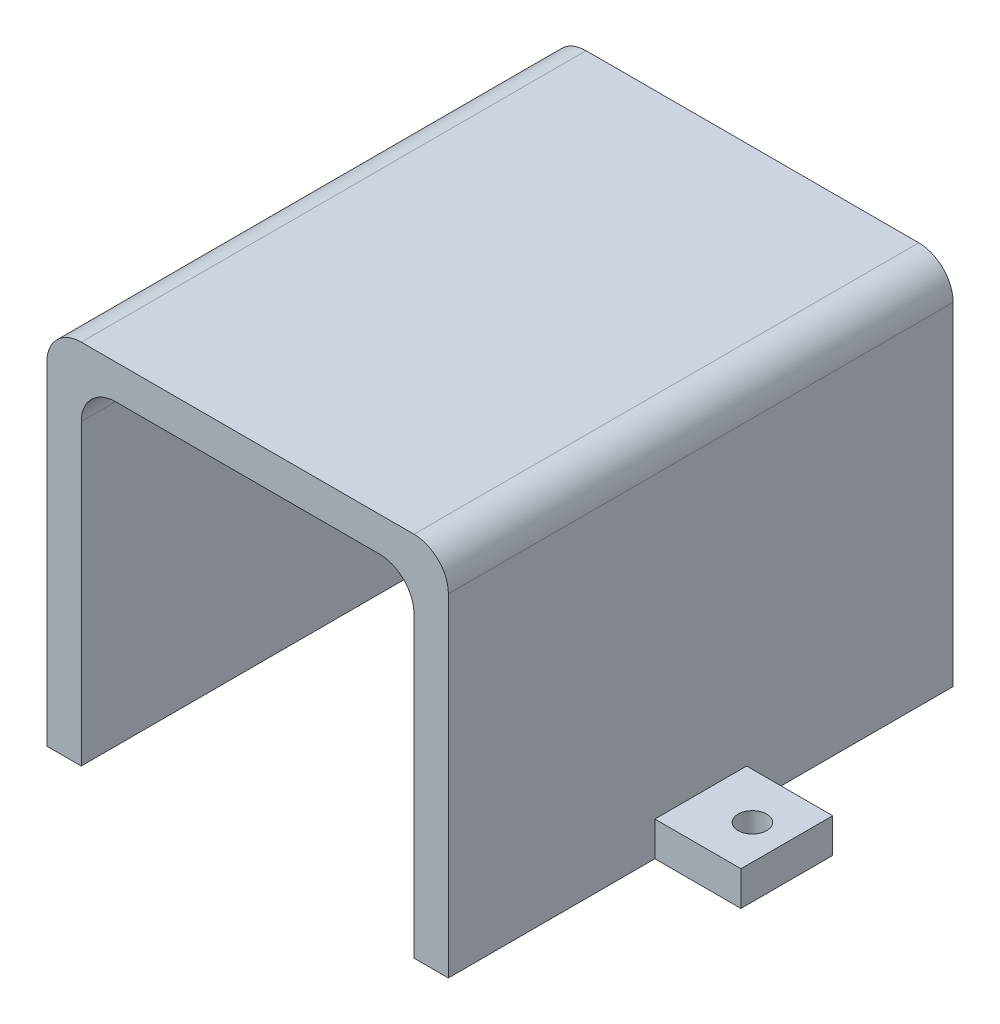
ISO-10303-21;
HEADER;
FILE_DESCRIPTION(('STEP AP214'),'2;1');
FILE_NAME('part.step','',(''),(''),'','','');
FILE_SCHEMA(('AUTOMOTIVE_DESIGN { 1 0 10303 214 1 1 1 1 }'));
ENDSEC;
DATA;
#1=APPLICATION_CONTEXT('core data for automotive mechanical design processes');
#2=APPLICATION_PROTOCOL_DEFINITION('international standard','automotive_design',2000,#1);
#3=PRODUCT_CONTEXT('',#1,'mechanical');
#4=PRODUCT('Part','Part','',(#3));
#5=PRODUCT_RELATED_PRODUCT_CATEGORY('part','',(#4));
#6=PRODUCT_DEFINITION_FORMATION('','',#4);
#7=PRODUCT_DEFINITION_CONTEXT('part definition',#1,'design');
#8=PRODUCT_DEFINITION('design','',#6,#7);
#9=PRODUCT_DEFINITION_SHAPE('','',#8);
#10=(LENGTH_UNIT() NAMED_UNIT(*) SI_UNIT(.MILLI.,.METRE.));
#11=(NAMED_UNIT(*) PLANE_ANGLE_UNIT() SI_UNIT($,.RADIAN.));
#12=(NAMED_UNIT(*) SI_UNIT($,.STERADIAN.) SOLID_ANGLE_UNIT());
#13=UNCERTAINTY_MEASURE_WITH_UNIT(LENGTH_MEASURE(1.E-05),#10,'distance_accuracy_value','');
#14=(GEOMETRIC_REPRESENTATION_CONTEXT(3) GLOBAL_UNCERTAINTY_ASSIGNED_CONTEXT((#13)) GLOBAL_UNIT_ASSIGNED_CONTEXT((#10,
#11,#12)) REPRESENTATION_CONTEXT('',''));
#15=CARTESIAN_POINT('',(0.,0.,0.));
#16=DIRECTION('',(0.,0.,1.));
#17=DIRECTION('',(1.,0.,0.));
#18=AXIS2_PLACEMENT_3D('',#15,#16,#17);
#19=CARTESIAN_POINT('',(-17.5,-12.,-4.));
#20=DIRECTION('',(0.,0.,-1.));
#21=DIRECTION('',(-1.,0.,0.));
#22=AXIS2_PLACEMENT_3D('',#19,#20,#21);
#23=PLANE('',#22);
#24=DIRECTION('',(1.,0.,0.));
#25=VECTOR('',#24,1.);
#26=CARTESIAN_POINT('',(-17.5,-15.,-4.));
#27=LINE('',#26,#25);
#28=CARTESIAN_POINT('',(-25.,-15.,-3.99999999999999));
#29=VERTEX_POINT('',#28);
#30=CARTESIAN_POINT('',(-17.5,-15.,-4.));
#31=VERTEX_POINT('',#30);
#32=EDGE_CURVE('E108',#29,#31,#27,.T.);
#33=ORIENTED_EDGE('',*,*,#32,.F.);
#34=DIRECTION('',(0.,-1.,0.));
#35=VECTOR('',#34,1.);
#36=CARTESIAN_POINT('',(-25.,-12.,-3.99999999999999));
#37=LINE('',#36,#35);
#38=CARTESIAN_POINT('',(-25.,-12.,-3.99999999999999));
#39=VERTEX_POINT('',#38);
#40=EDGE_CURVE('E12',#39,#29,#37,.T.);
#41=ORIENTED_EDGE('',*,*,#40,.F.);
#42=DIRECTION('',(1.,0.,0.));
#43=VECTOR('',#42,1.);
#44=CARTESIAN_POINT('',(-17.5,-12.,-4.));
#45=LINE('',#44,#43);
#46=CARTESIAN_POINT('',(-17.5,-12.,-4.));
#47=VERTEX_POINT('',#46);
#48=EDGE_CURVE('E101',#39,#47,#45,.T.);
#49=ORIENTED_EDGE('',*,*,#48,.T.);
#50=DIRECTION('',(0.,-1.,0.));
#51=VECTOR('',#50,1.);
#52=CARTESIAN_POINT('',(-17.5,-12.,-4.));
#53=LINE('',#52,#51);
#54=EDGE_CURVE('E46',#47,#31,#53,.T.);
#55=ORIENTED_EDGE('',*,*,#54,.T.);
#56=EDGE_LOOP('',(#33,#41,#49,#55));
#57=FACE_BOUND('',#56,.T.);
#58=ADVANCED_FACE('F43',(#57),#23,.T.);
#59=CARTESIAN_POINT('',(-25.,-12.,-3.99999999999999));
#60=DIRECTION('',(-1.,0.,0.));
#61=DIRECTION('',(0.,0.,1.));
#62=AXIS2_PLACEMENT_3D('',#59,#60,#61);
#63=PLANE('',#62);
#64=DIRECTION('',(0.,0.,-1.));
#65=VECTOR('',#64,1.);
#66=CARTESIAN_POINT('',(-25.,-15.,-3.99999999999999));
#67=LINE('',#66,#65);
#68=CARTESIAN_POINT('',(-25.,-15.,3.99999999999999));
#69=VERTEX_POINT('',#68);
#70=EDGE_CURVE('E103',#69,#29,#67,.T.);
#71=ORIENTED_EDGE('',*,*,#70,.F.);
#72=DIRECTION('',(0.,-1.,0.));
#73=VECTOR('',#72,1.);
#74=CARTESIAN_POINT('',(-25.,-12.,3.99999999999999));
#75=LINE('',#74,#73);
#76=CARTESIAN_POINT('',(-25.,-12.,3.99999999999999));
#77=VERTEX_POINT('',#76);
#78=EDGE_CURVE('E52',#77,#69,#75,.T.);
#79=ORIENTED_EDGE('',*,*,#78,.F.);
#80=DIRECTION('',(0.,0.,-1.));
#81=VECTOR('',#80,1.);
#82=CARTESIAN_POINT('',(-25.,-12.,-3.99999999999999));
#83=LINE('',#82,#81);
#84=EDGE_CURVE('E98',#77,#39,#83,.T.);
#85=ORIENTED_EDGE('',*,*,#84,.T.);
#86=ORIENTED_EDGE('',*,*,#40,.T.);
#87=EDGE_LOOP('',(#71,#79,#85,#86));
#88=FACE_BOUND('',#87,.T.);
#89=ADVANCED_FACE('F119',(#88),#63,.T.);
#90=CARTESIAN_POINT('',(-17.5,-12.,4.));
#91=DIRECTION('',(0.,0.,1.));
#92=DIRECTION('',(1.,0.,0.));
#93=AXIS2_PLACEMENT_3D('',#90,#91,#92);
#94=PLANE('',#93);
#95=DIRECTION('',(-1.,0.,0.));
#96=VECTOR('',#95,1.);
#97=CARTESIAN_POINT('',(-17.5,-15.,4.));
#98=LINE('',#97,#96);
#99=CARTESIAN_POINT('',(-17.5,-15.,4.));
#100=VERTEX_POINT('',#99);
#101=EDGE_CURVE('E93',#100,#69,#98,.T.);
#102=ORIENTED_EDGE('',*,*,#101,.F.);
#103=DIRECTION('',(0.,-1.,0.));
#104=VECTOR('',#103,1.);
#105=CARTESIAN_POINT('',(-17.5,-12.,4.));
#106=LINE('',#105,#104);
#107=CARTESIAN_POINT('',(-17.5,-12.,4.));
#108=VERTEX_POINT('',#107);
#109=EDGE_CURVE('E88',#108,#100,#106,.T.);
#110=ORIENTED_EDGE('',*,*,#109,.F.);
#111=DIRECTION('',(-1.,0.,0.));
#112=VECTOR('',#111,1.);
#113=CARTESIAN_POINT('',(-17.5,-12.,4.));
#114=LINE('',#113,#112);
#115=EDGE_CURVE('E91',#108,#77,#114,.T.);
#116=ORIENTED_EDGE('',*,*,#115,.T.);
#117=ORIENTED_EDGE('',*,*,#78,.T.);
#118=EDGE_LOOP('',(#102,#110,#116,#117));
#119=FACE_BOUND('',#118,.T.);
#120=ADVANCED_FACE('F90',(#119),#94,.T.);
#121=CARTESIAN_POINT('',(-17.5,-12.,-4.));
#122=DIRECTION('',(1.,0.,0.));
#123=DIRECTION('',(0.,0.,-1.));
#124=AXIS2_PLACEMENT_3D('',#121,#122,#123);
#125=PLANE('',#124);
#126=DIRECTION('',(0.,0.,1.));
#127=VECTOR('',#126,1.);
#128=CARTESIAN_POINT('',(-17.5,-15.,-4.));
#129=LINE('',#128,#127);
#130=EDGE_CURVE('E111',#31,#100,#129,.T.);
#131=ORIENTED_EDGE('',*,*,#130,.F.);
#132=ORIENTED_EDGE('',*,*,#54,.F.);
#133=DIRECTION('',(0.,0.,1.));
#134=VECTOR('',#133,1.);
#135=CARTESIAN_POINT('',(-17.5,-12.,-4.));
#136=LINE('',#135,#134);
#137=EDGE_CURVE('E97',#47,#108,#136,.T.);
#138=ORIENTED_EDGE('',*,*,#137,.T.);
#139=ORIENTED_EDGE('',*,*,#109,.T.);
#140=EDGE_LOOP('',(#131,#132,#138,#139));
#141=FACE_BOUND('',#140,.T.);
#142=ADVANCED_FACE('F100',(#141),#125,.T.);
#143=CARTESIAN_POINT('',(0.,-12.,0.));
#144=DIRECTION('',(0.,1.,0.));
#145=DIRECTION('',(0.,0.,1.));
#146=AXIS2_PLACEMENT_3D('',#143,#144,#145);
#147=PLANE('',#146);
#148=CARTESIAN_POINT('',(-22.,-12.,0.));
#149=DIRECTION('',(0.,-1.,0.));
#150=DIRECTION('',(0.,0.,-1.));
#151=AXIS2_PLACEMENT_3D('',#148,#149,#150);
#152=CIRCLE('',#151,1.25);
#153=CARTESIAN_POINT('',(-22.,-12.,-1.25000000000001));
#154=VERTEX_POINT('',#153);
#155=EDGE_CURVE('E112',#154,#154,#152,.T.);
#156=ORIENTED_EDGE('',*,*,#155,.T.);
#157=EDGE_LOOP('',(#156));
#158=FACE_BOUND('',#157,.T.);
#159=ORIENTED_EDGE('',*,*,#48,.F.);
#160=ORIENTED_EDGE('',*,*,#84,.F.);
#161=ORIENTED_EDGE('',*,*,#115,.F.);
#162=ORIENTED_EDGE('',*,*,#137,.F.);
#163=EDGE_LOOP('',(#159,#160,#161,#162));
#164=FACE_BOUND('',#163,.T.);
#165=ADVANCED_FACE('F96',(#158,#164),#147,.T.);
#166=CARTESIAN_POINT('',(0.,-15.,0.));
#167=DIRECTION('',(0.,1.,0.));
#168=DIRECTION('',(0.,0.,1.));
#169=AXIS2_PLACEMENT_3D('',#166,#167,#168);
#170=PLANE('',#169);
#171=CARTESIAN_POINT('',(-22.,-15.,0.));
#172=DIRECTION('',(0.,-1.,0.));
#173=DIRECTION('',(0.,0.,-1.));
#174=AXIS2_PLACEMENT_3D('',#171,#172,#173);
#175=CIRCLE('',#174,1.24999999999999);
#176=CARTESIAN_POINT('',(-22.,-15.,-1.25));
#177=VERTEX_POINT('',#176);
#178=EDGE_CURVE('E149',#177,#177,#175,.T.);
#179=ORIENTED_EDGE('',*,*,#178,.F.);
#180=EDGE_LOOP('',(#179));
#181=FACE_BOUND('',#180,.T.);
#182=ORIENTED_EDGE('',*,*,#32,.T.);
#183=ORIENTED_EDGE('',*,*,#130,.T.);
#184=ORIENTED_EDGE('',*,*,#101,.T.);
#185=ORIENTED_EDGE('',*,*,#70,.T.);
#186=EDGE_LOOP('',(#182,#183,#184,#185));
#187=FACE_BOUND('',#186,.T.);
#188=ADVANCED_FACE('F118',(#181,#187),#170,.F.);
#189=CARTESIAN_POINT('',(-22.,-15.,0.));
#190=DIRECTION('',(0.,-1.,0.));
#191=DIRECTION('',(0.,0.,-1.));
#192=AXIS2_PLACEMENT_3D('',#189,#190,#191);
#193=CYLINDRICAL_SURFACE('',#192,1.24999999999999);
#194=ORIENTED_EDGE('',*,*,#155,.F.);
#195=EDGE_LOOP('',(#194));
#196=FACE_BOUND('',#195,.T.);
#197=ORIENTED_EDGE('',*,*,#178,.T.);
#198=EDGE_LOOP('',(#197));
#199=FACE_BOUND('',#198,.T.);
#200=ADVANCED_FACE('F137',(#196,#199),#193,.F.);
#201=CLOSED_SHELL('',(#58,#89,#120,#142,#165,#188,#200));
#202=MANIFOLD_SOLID_BREP('B2',#201);
#203=CARTESIAN_POINT('',(17.5,-12.,-4.));
#204=DIRECTION('',(-1.,0.,0.));
#205=DIRECTION('',(0.,0.,1.));
#206=AXIS2_PLACEMENT_3D('',#203,#204,#205);
#207=PLANE('',#206);
#208=DIRECTION('',(0.,0.,-1.));
#209=VECTOR('',#208,1.);
#210=CARTESIAN_POINT('',(17.5,-15.,-4.));
#211=LINE('',#210,#209);
#212=CARTESIAN_POINT('',(17.5,-15.,4.));
#213=VERTEX_POINT('',#212);
#214=CARTESIAN_POINT('',(17.5,-15.,-4.));
#215=VERTEX_POINT('',#214);
#216=EDGE_CURVE('E261',#213,#215,#211,.T.);
#217=ORIENTED_EDGE('',*,*,#216,.F.);
#218=DIRECTION('',(0.,-1.,0.));
#219=VECTOR('',#218,1.);
#220=CARTESIAN_POINT('',(17.5,-12.,4.));
#221=LINE('',#220,#219);
#222=CARTESIAN_POINT('',(17.5,-12.,4.));
#223=VERTEX_POINT('',#222);
#224=EDGE_CURVE('E41',#223,#213,#221,.T.);
#225=ORIENTED_EDGE('',*,*,#224,.F.);
#226=DIRECTION('',(0.,0.,-1.));
#227=VECTOR('',#226,1.);
#228=CARTESIAN_POINT('',(17.5,-12.,-4.));
#229=LINE('',#228,#227);
#230=CARTESIAN_POINT('',(17.5,-12.,-4.));
#231=VERTEX_POINT('',#230);
#232=EDGE_CURVE('E254',#223,#231,#229,.T.);
#233=ORIENTED_EDGE('',*,*,#232,.T.);
#234=DIRECTION('',(0.,-1.,0.));
#235=VECTOR('',#234,1.);
#236=CARTESIAN_POINT('',(17.5,-12.,-4.));
#237=LINE('',#236,#235);
#238=EDGE_CURVE('E199',#231,#215,#237,.T.);
#239=ORIENTED_EDGE('',*,*,#238,.T.);
#240=EDGE_LOOP('',(#217,#225,#233,#239));
#241=FACE_BOUND('',#240,.T.);
#242=ADVANCED_FACE('F196',(#241),#207,.T.);
#243=CARTESIAN_POINT('',(17.5,-12.,4.));
#244=DIRECTION('',(0.,0.,1.));
#245=DIRECTION('',(1.,0.,0.));
#246=AXIS2_PLACEMENT_3D('',#243,#244,#245);
#247=PLANE('',#246);
#248=DIRECTION('',(-1.,0.,0.));
#249=VECTOR('',#248,1.);
#250=CARTESIAN_POINT('',(17.5,-15.,4.));
#251=LINE('',#250,#249);
#252=CARTESIAN_POINT('',(25.,-15.,4.));
#253=VERTEX_POINT('',#252);
#254=EDGE_CURVE('E256',#253,#213,#251,.T.);
#255=ORIENTED_EDGE('',*,*,#254,.F.);
#256=DIRECTION('',(0.,-1.,0.));
#257=VECTOR('',#256,1.);
#258=CARTESIAN_POINT('',(25.,-12.,4.));
#259=LINE('',#258,#257);
#260=CARTESIAN_POINT('',(25.,-12.,4.));
#261=VERTEX_POINT('',#260);
#262=EDGE_CURVE('E205',#261,#253,#259,.T.);
#263=ORIENTED_EDGE('',*,*,#262,.F.);
#264=DIRECTION('',(-1.,0.,0.));
#265=VECTOR('',#264,1.);
#266=CARTESIAN_POINT('',(17.5,-12.,4.));
#267=LINE('',#266,#265);
#268=EDGE_CURVE('E251',#261,#223,#267,.T.);
#269=ORIENTED_EDGE('',*,*,#268,.T.);
#270=ORIENTED_EDGE('',*,*,#224,.T.);
#271=EDGE_LOOP('',(#255,#263,#269,#270));
#272=FACE_BOUND('',#271,.T.);
#273=ADVANCED_FACE('F272',(#272),#247,.T.);
#274=CARTESIAN_POINT('',(25.,-12.,-4.));
#275=DIRECTION('',(1.,0.,0.));
#276=DIRECTION('',(0.,0.,-1.));
#277=AXIS2_PLACEMENT_3D('',#274,#275,#276);
#278=PLANE('',#277);
#279=DIRECTION('',(0.,0.,1.));
#280=VECTOR('',#279,1.);
#281=CARTESIAN_POINT('',(25.,-15.,-4.));
#282=LINE('',#281,#280);
#283=CARTESIAN_POINT('',(25.,-15.,-4.));
#284=VERTEX_POINT('',#283);
#285=EDGE_CURVE('E246',#284,#253,#282,.T.);
#286=ORIENTED_EDGE('',*,*,#285,.F.);
#287=DIRECTION('',(0.,-1.,0.));
#288=VECTOR('',#287,1.);
#289=CARTESIAN_POINT('',(25.,-12.,-4.));
#290=LINE('',#289,#288);
#291=CARTESIAN_POINT('',(25.,-12.,-4.));
#292=VERTEX_POINT('',#291);
#293=EDGE_CURVE('E241',#292,#284,#290,.T.);
#294=ORIENTED_EDGE('',*,*,#293,.F.);
#295=DIRECTION('',(0.,0.,1.));
#296=VECTOR('',#295,1.);
#297=CARTESIAN_POINT('',(25.,-12.,-4.));
#298=LINE('',#297,#296);
#299=EDGE_CURVE('E244',#292,#261,#298,.T.);
#300=ORIENTED_EDGE('',*,*,#299,.T.);
#301=ORIENTED_EDGE('',*,*,#262,.T.);
#302=EDGE_LOOP('',(#286,#294,#300,#301));
#303=FACE_BOUND('',#302,.T.);
#304=ADVANCED_FACE('F243',(#303),#278,.T.);
#305=CARTESIAN_POINT('',(17.5,-12.,-4.));
#306=DIRECTION('',(0.,0.,-1.));
#307=DIRECTION('',(-1.,0.,0.));
#308=AXIS2_PLACEMENT_3D('',#305,#306,#307);
#309=PLANE('',#308);
#310=DIRECTION('',(1.,0.,0.));
#311=VECTOR('',#310,1.);
#312=CARTESIAN_POINT('',(17.5,-15.,-4.));
#313=LINE('',#312,#311);
#314=EDGE_CURVE('E264',#215,#284,#313,.T.);
#315=ORIENTED_EDGE('',*,*,#314,.F.);
#316=ORIENTED_EDGE('',*,*,#238,.F.);
#317=DIRECTION('',(1.,0.,0.));
#318=VECTOR('',#317,1.);
#319=CARTESIAN_POINT('',(17.5,-12.,-4.));
#320=LINE('',#319,#318);
#321=EDGE_CURVE('E250',#231,#292,#320,.T.);
#322=ORIENTED_EDGE('',*,*,#321,.T.);
#323=ORIENTED_EDGE('',*,*,#293,.T.);
#324=EDGE_LOOP('',(#315,#316,#322,#323));
#325=FACE_BOUND('',#324,.T.);
#326=ADVANCED_FACE('F253',(#325),#309,.T.);
#327=CARTESIAN_POINT('',(0.,-12.,0.));
#328=DIRECTION('',(0.,1.,0.));
#329=DIRECTION('',(0.,0.,1.));
#330=AXIS2_PLACEMENT_3D('',#327,#328,#329);
#331=PLANE('',#330);
#332=CARTESIAN_POINT('',(22.,-12.,0.));
#333=DIRECTION('',(0.,-1.,0.));
#334=DIRECTION('',(0.,0.,-1.));
#335=AXIS2_PLACEMENT_3D('',#332,#333,#334);
#336=CIRCLE('',#335,1.25);
#337=CARTESIAN_POINT('',(22.,-12.,-1.25));
#338=VERTEX_POINT('',#337);
#339=EDGE_CURVE('E265',#338,#338,#336,.T.);
#340=ORIENTED_EDGE('',*,*,#339,.T.);
#341=EDGE_LOOP('',(#340));
#342=FACE_BOUND('',#341,.T.);
#343=ORIENTED_EDGE('',*,*,#232,.F.);
#344=ORIENTED_EDGE('',*,*,#268,.F.);
#345=ORIENTED_EDGE('',*,*,#299,.F.);
#346=ORIENTED_EDGE('',*,*,#321,.F.);
#347=EDGE_LOOP('',(#343,#344,#345,#346));
#348=FACE_BOUND('',#347,.T.);
#349=ADVANCED_FACE('F249',(#342,#348),#331,.T.);
#350=CARTESIAN_POINT('',(0.,-15.,0.));
#351=DIRECTION('',(0.,1.,0.));
#352=DIRECTION('',(0.,0.,1.));
#353=AXIS2_PLACEMENT_3D('',#350,#351,#352);
#354=PLANE('',#353);
#355=CARTESIAN_POINT('',(22.,-15.,0.));
#356=DIRECTION('',(0.,-1.,0.));
#357=DIRECTION('',(0.,0.,-1.));
#358=AXIS2_PLACEMENT_3D('',#355,#356,#357);
#359=CIRCLE('',#358,1.24999999999999);
#360=CARTESIAN_POINT('',(22.,-15.,-1.24999999999999));
#361=VERTEX_POINT('',#360);
#362=EDGE_CURVE('E302',#361,#361,#359,.T.);
#363=ORIENTED_EDGE('',*,*,#362,.F.);
#364=EDGE_LOOP('',(#363));
#365=FACE_BOUND('',#364,.T.);
#366=ORIENTED_EDGE('',*,*,#216,.T.);
#367=ORIENTED_EDGE('',*,*,#314,.T.);
#368=ORIENTED_EDGE('',*,*,#285,.T.);
#369=ORIENTED_EDGE('',*,*,#254,.T.);
#370=EDGE_LOOP('',(#366,#367,#368,#369));
#371=FACE_BOUND('',#370,.T.);
#372=ADVANCED_FACE('F271',(#365,#371),#354,.F.);
#373=CARTESIAN_POINT('',(22.,-15.,0.));
#374=DIRECTION('',(0.,-1.,0.));
#375=DIRECTION('',(0.,0.,-1.));
#376=AXIS2_PLACEMENT_3D('',#373,#374,#375);
#377=CYLINDRICAL_SURFACE('',#376,1.24999999999999);
#378=ORIENTED_EDGE('',*,*,#339,.F.);
#379=EDGE_LOOP('',(#378));
#380=FACE_BOUND('',#379,.T.);
#381=ORIENTED_EDGE('',*,*,#362,.T.);
#382=EDGE_LOOP('',(#381));
#383=FACE_BOUND('',#382,.T.);
#384=ADVANCED_FACE('F290',(#380,#383),#377,.F.);
#385=CLOSED_SHELL('',(#242,#273,#304,#326,#349,#372,#384));
#386=MANIFOLD_SOLID_BREP('B6',#385);
#387=CARTESIAN_POINT('',(14.5,-15.,22.));
#388=DIRECTION('',(1.,0.,0.));
#389=DIRECTION('',(0.,0.,-1.));
#390=AXIS2_PLACEMENT_3D('',#387,#388,#389);
#391=PLANE('',#390);
#392=DIRECTION('',(0.,-1.,0.));
#393=VECTOR('',#392,1.);
#394=CARTESIAN_POINT('',(14.5,-15.,22.));
#395=LINE('',#394,#393);
#396=CARTESIAN_POINT('',(14.5,11.,22.));
#397=VERTEX_POINT('',#396);
#398=CARTESIAN_POINT('',(14.5,-15.,22.));
#399=VERTEX_POINT('',#398);
#400=EDGE_CURVE('E431',#397,#399,#395,.T.);
#401=ORIENTED_EDGE('',*,*,#400,.F.);
#402=DIRECTION('',(0.,0.,-1.));
#403=VECTOR('',#402,1.);
#404=CARTESIAN_POINT('',(14.5,11.,-22.));
#405=LINE('',#404,#403);
#406=CARTESIAN_POINT('',(14.5,11.,-22.));
#407=VERTEX_POINT('',#406);
#408=EDGE_CURVE('E456',#397,#407,#405,.T.);
#409=ORIENTED_EDGE('',*,*,#408,.T.);
#410=DIRECTION('',(0.,-1.,0.));
#411=VECTOR('',#410,1.);
#412=CARTESIAN_POINT('',(14.5,-15.,-22.));
#413=LINE('',#412,#411);
#414=CARTESIAN_POINT('',(14.5,-15.,-22.));
#415=VERTEX_POINT('',#414);
#416=EDGE_CURVE('E454',#407,#415,#413,.T.);
#417=ORIENTED_EDGE('',*,*,#416,.T.);
#418=DIRECTION('',(0.,0.,-1.));
#419=VECTOR('',#418,1.);
#420=CARTESIAN_POINT('',(14.5,-15.,22.));
#421=LINE('',#420,#419);
#422=EDGE_CURVE('E448',#399,#415,#421,.T.);
#423=ORIENTED_EDGE('',*,*,#422,.F.);
#424=EDGE_LOOP('',(#401,#409,#417,#423));
#425=FACE_BOUND('',#424,.T.);
#426=ADVANCED_FACE('F340',(#425),#391,.F.);
#427=CARTESIAN_POINT('',(14.5,-15.,22.));
#428=DIRECTION('',(0.,1.,0.));
#429=DIRECTION('',(0.,0.,1.));
#430=AXIS2_PLACEMENT_3D('',#427,#428,#429);
#431=PLANE('',#430);
#432=DIRECTION('',(1.,0.,0.));
#433=VECTOR('',#432,1.);
#434=CARTESIAN_POINT('',(14.5,-15.,-22.));
#435=LINE('',#434,#433);
#436=CARTESIAN_POINT('',(17.5,-15.,-22.));
#437=VERTEX_POINT('',#436);
#438=EDGE_CURVE('E524',#415,#437,#435,.T.);
#439=ORIENTED_EDGE('',*,*,#438,.T.);
#440=DIRECTION('',(0.,0.,-1.));
#441=VECTOR('',#440,1.);
#442=CARTESIAN_POINT('',(17.5,-15.,22.));
#443=LINE('',#442,#441);
#444=CARTESIAN_POINT('',(17.5,-15.,22.));
#445=VERTEX_POINT('',#444);
#446=EDGE_CURVE('E450',#445,#437,#443,.T.);
#447=ORIENTED_EDGE('',*,*,#446,.F.);
#448=DIRECTION('',(1.,0.,0.));
#449=VECTOR('',#448,1.);
#450=CARTESIAN_POINT('',(14.5,-15.,22.));
#451=LINE('',#450,#449);
#452=EDGE_CURVE('E434',#399,#445,#451,.T.);
#453=ORIENTED_EDGE('',*,*,#452,.F.);
#454=ORIENTED_EDGE('',*,*,#422,.T.);
#455=EDGE_LOOP('',(#439,#447,#453,#454));
#456=FACE_BOUND('',#455,.T.);
#457=ADVANCED_FACE('F447',(#456),#431,.F.);
#458=CARTESIAN_POINT('',(17.5,-15.,22.));
#459=DIRECTION('',(-1.,0.,0.));
#460=DIRECTION('',(0.,0.,1.));
#461=AXIS2_PLACEMENT_3D('',#458,#459,#460);
#462=PLANE('',#461);
#463=DIRECTION('',(0.,1.,0.));
#464=VECTOR('',#463,1.);
#465=CARTESIAN_POINT('',(17.5,-15.,-22.));
#466=LINE('',#465,#464);
#467=CARTESIAN_POINT('',(17.5,14.,-22.));
#468=VERTEX_POINT('',#467);
#469=EDGE_CURVE('E526',#437,#468,#466,.T.);
#470=ORIENTED_EDGE('',*,*,#469,.T.);
#471=DIRECTION('',(0.,0.,-1.));
#472=VECTOR('',#471,1.);
#473=CARTESIAN_POINT('',(17.5,14.,22.));
#474=LINE('',#473,#472);
#475=CARTESIAN_POINT('',(17.5,14.,22.));
#476=VERTEX_POINT('',#475);
#477=EDGE_CURVE('E355',#468,#476,#474,.F.);
#478=ORIENTED_EDGE('',*,*,#477,.T.);
#479=DIRECTION('',(0.,1.,0.));
#480=VECTOR('',#479,1.);
#481=CARTESIAN_POINT('',(17.5,-15.,22.));
#482=LINE('',#481,#480);
#483=EDGE_CURVE('E451',#445,#476,#482,.T.);
#484=ORIENTED_EDGE('',*,*,#483,.F.);
#485=ORIENTED_EDGE('',*,*,#446,.T.);
#486=EDGE_LOOP('',(#470,#478,#484,#485));
#487=FACE_BOUND('',#486,.T.);
#488=ADVANCED_FACE('F556',(#487),#462,.F.);
#489=CARTESIAN_POINT('',(-17.5,17.,22.));
#490=DIRECTION('',(0.,-1.,0.));
#491=DIRECTION('',(0.,0.,-1.));
#492=AXIS2_PLACEMENT_3D('',#489,#490,#491);
#493=PLANE('',#492);
#494=DIRECTION('',(-1.,0.,0.));
#495=VECTOR('',#494,1.);
#496=CARTESIAN_POINT('',(-17.5,17.,-22.));
#497=LINE('',#496,#495);
#498=CARTESIAN_POINT('',(14.5,17.,-22.));
#499=VERTEX_POINT('',#498);
#500=CARTESIAN_POINT('',(-14.5,17.,-22.));
#501=VERTEX_POINT('',#500);
#502=EDGE_CURVE('E528',#499,#501,#497,.T.);
#503=ORIENTED_EDGE('',*,*,#502,.T.);
#504=DIRECTION('',(0.,0.,-1.));
#505=VECTOR('',#504,1.);
#506=CARTESIAN_POINT('',(-14.5,17.,22.));
#507=LINE('',#506,#505);
#508=CARTESIAN_POINT('',(-14.5,17.,22.));
#509=VERTEX_POINT('',#508);
#510=EDGE_CURVE('E363',#501,#509,#507,.F.);
#511=ORIENTED_EDGE('',*,*,#510,.T.);
#512=DIRECTION('',(-1.,0.,0.));
#513=VECTOR('',#512,1.);
#514=CARTESIAN_POINT('',(-17.5,17.,22.));
#515=LINE('',#514,#513);
#516=CARTESIAN_POINT('',(14.5,17.,22.));
#517=VERTEX_POINT('',#516);
#518=EDGE_CURVE('E547',#517,#509,#515,.T.);
#519=ORIENTED_EDGE('',*,*,#518,.F.);
#520=DIRECTION('',(0.,0.,-1.));
#521=VECTOR('',#520,1.);
#522=CARTESIAN_POINT('',(14.5,17.,22.));
#523=LINE('',#522,#521);
#524=EDGE_CURVE('E477',#517,#499,#523,.T.);
#525=ORIENTED_EDGE('',*,*,#524,.T.);
#526=EDGE_LOOP('',(#503,#511,#519,#525));
#527=FACE_BOUND('',#526,.T.);
#528=ADVANCED_FACE('F554',(#527),#493,.F.);
#529=CARTESIAN_POINT('',(-17.5,-15.,22.));
#530=DIRECTION('',(1.,0.,0.));
#531=DIRECTION('',(0.,0.,-1.));
#532=AXIS2_PLACEMENT_3D('',#529,#530,#531);
#533=PLANE('',#532);
#534=DIRECTION('',(0.,-1.,0.));
#535=VECTOR('',#534,1.);
#536=CARTESIAN_POINT('',(-17.5,-15.,22.));
#537=LINE('',#536,#535);
#538=CARTESIAN_POINT('',(-17.5,14.,22.));
#539=VERTEX_POINT('',#538);
#540=CARTESIAN_POINT('',(-17.5,-15.,22.));
#541=VERTEX_POINT('',#540);
#542=EDGE_CURVE('E543',#539,#541,#537,.T.);
#543=ORIENTED_EDGE('',*,*,#542,.F.);
#544=DIRECTION('',(0.,0.,-1.));
#545=VECTOR('',#544,1.);
#546=CARTESIAN_POINT('',(-17.5,14.,22.));
#547=LINE('',#546,#545);
#548=CARTESIAN_POINT('',(-17.5,14.,-22.));
#549=VERTEX_POINT('',#548);
#550=EDGE_CURVE('E470',#539,#549,#547,.T.);
#551=ORIENTED_EDGE('',*,*,#550,.T.);
#552=DIRECTION('',(0.,-1.,0.));
#553=VECTOR('',#552,1.);
#554=CARTESIAN_POINT('',(-17.5,-15.,-22.));
#555=LINE('',#554,#553);
#556=CARTESIAN_POINT('',(-17.5,-15.,-22.));
#557=VERTEX_POINT('',#556);
#558=EDGE_CURVE('E530',#549,#557,#555,.T.);
#559=ORIENTED_EDGE('',*,*,#558,.T.);
#560=DIRECTION('',(0.,0.,-1.));
#561=VECTOR('',#560,1.);
#562=CARTESIAN_POINT('',(-17.5,-15.,22.));
#563=LINE('',#562,#561);
#564=EDGE_CURVE('E460',#541,#557,#563,.T.);
#565=ORIENTED_EDGE('',*,*,#564,.F.);
#566=EDGE_LOOP('',(#543,#551,#559,#565));
#567=FACE_BOUND('',#566,.T.);
#568=ADVANCED_FACE('F541',(#567),#533,.F.);
#569=CARTESIAN_POINT('',(-17.5,-15.,22.));
#570=DIRECTION('',(0.,1.,0.));
#571=DIRECTION('',(0.,0.,1.));
#572=AXIS2_PLACEMENT_3D('',#569,#570,#571);
#573=PLANE('',#572);
#574=DIRECTION('',(1.,0.,0.));
#575=VECTOR('',#574,1.);
#576=CARTESIAN_POINT('',(-17.5,-15.,-22.));
#577=LINE('',#576,#575);
#578=CARTESIAN_POINT('',(-14.5,-15.,-22.));
#579=VERTEX_POINT('',#578);
#580=EDGE_CURVE('E507',#557,#579,#577,.T.);
#581=ORIENTED_EDGE('',*,*,#580,.T.);
#582=DIRECTION('',(0.,0.,-1.));
#583=VECTOR('',#582,1.);
#584=CARTESIAN_POINT('',(-14.5,-15.,22.));
#585=LINE('',#584,#583);
#586=CARTESIAN_POINT('',(-14.5,-15.,22.));
#587=VERTEX_POINT('',#586);
#588=EDGE_CURVE('E506',#587,#579,#585,.T.);
#589=ORIENTED_EDGE('',*,*,#588,.F.);
#590=DIRECTION('',(1.,0.,0.));
#591=VECTOR('',#590,1.);
#592=CARTESIAN_POINT('',(-17.5,-15.,22.));
#593=LINE('',#592,#591);
#594=EDGE_CURVE('E519',#541,#587,#593,.T.);
#595=ORIENTED_EDGE('',*,*,#594,.F.);
#596=ORIENTED_EDGE('',*,*,#564,.T.);
#597=EDGE_LOOP('',(#581,#589,#595,#596));
#598=FACE_BOUND('',#597,.T.);
#599=ADVANCED_FACE('F537',(#598),#573,.F.);
#600=CARTESIAN_POINT('',(-14.5,-15.,22.));
#601=DIRECTION('',(-1.,0.,0.));
#602=DIRECTION('',(0.,0.,1.));
#603=AXIS2_PLACEMENT_3D('',#600,#601,#602);
#604=PLANE('',#603);
#605=DIRECTION('',(0.,1.,0.));
#606=VECTOR('',#605,1.);
#607=CARTESIAN_POINT('',(-14.5,-15.,-22.));
#608=LINE('',#607,#606);
#609=CARTESIAN_POINT('',(-14.5,11.,-22.));
#610=VERTEX_POINT('',#609);
#611=EDGE_CURVE('E495',#579,#610,#608,.T.);
#612=ORIENTED_EDGE('',*,*,#611,.T.);
#613=DIRECTION('',(0.,0.,-1.));
#614=VECTOR('',#613,1.);
#615=CARTESIAN_POINT('',(-14.5,11.,22.));
#616=LINE('',#615,#614);
#617=CARTESIAN_POINT('',(-14.5,11.,22.));
#618=VERTEX_POINT('',#617);
#619=EDGE_CURVE('E468',#610,#618,#616,.F.);
#620=ORIENTED_EDGE('',*,*,#619,.T.);
#621=DIRECTION('',(0.,1.,0.));
#622=VECTOR('',#621,1.);
#623=CARTESIAN_POINT('',(-14.5,-15.,22.));
#624=LINE('',#623,#622);
#625=EDGE_CURVE('E513',#587,#618,#624,.T.);
#626=ORIENTED_EDGE('',*,*,#625,.F.);
#627=ORIENTED_EDGE('',*,*,#588,.T.);
#628=EDGE_LOOP('',(#612,#620,#626,#627));
#629=FACE_BOUND('',#628,.T.);
#630=ADVANCED_FACE('F502',(#629),#604,.F.);
#631=CARTESIAN_POINT('',(-14.5,14.,22.));
#632=DIRECTION('',(0.,1.,0.));
#633=DIRECTION('',(0.,0.,1.));
#634=AXIS2_PLACEMENT_3D('',#631,#632,#633);
#635=PLANE('',#634);
#636=DIRECTION('',(1.,0.,0.));
#637=VECTOR('',#636,1.);
#638=CARTESIAN_POINT('',(-14.5,14.,-22.));
#639=LINE('',#638,#637);
#640=CARTESIAN_POINT('',(-11.5,14.,-22.));
#641=VERTEX_POINT('',#640);
#642=CARTESIAN_POINT('',(11.5,14.,-22.));
#643=VERTEX_POINT('',#642);
#644=EDGE_CURVE('E443',#641,#643,#639,.T.);
#645=ORIENTED_EDGE('',*,*,#644,.T.);
#646=DIRECTION('',(0.,0.,-1.));
#647=VECTOR('',#646,1.);
#648=CARTESIAN_POINT('',(11.5,14.,22.));
#649=LINE('',#648,#647);
#650=CARTESIAN_POINT('',(11.5,14.,22.));
#651=VERTEX_POINT('',#650);
#652=EDGE_CURVE('E466',#643,#651,#649,.F.);
#653=ORIENTED_EDGE('',*,*,#652,.T.);
#654=DIRECTION('',(1.,0.,0.));
#655=VECTOR('',#654,1.);
#656=CARTESIAN_POINT('',(-14.5,14.,22.));
#657=LINE('',#656,#655);
#658=CARTESIAN_POINT('',(-11.5,14.,22.));
#659=VERTEX_POINT('',#658);
#660=EDGE_CURVE('E512',#659,#651,#657,.T.);
#661=ORIENTED_EDGE('',*,*,#660,.F.);
#662=DIRECTION('',(0.,0.,-1.));
#663=VECTOR('',#662,1.);
#664=CARTESIAN_POINT('',(-11.5,14.,-22.));
#665=LINE('',#664,#663);
#666=EDGE_CURVE('E458',#659,#641,#665,.T.);
#667=ORIENTED_EDGE('',*,*,#666,.T.);
#668=EDGE_LOOP('',(#645,#653,#661,#667));
#669=FACE_BOUND('',#668,.T.);
#670=ADVANCED_FACE('F515',(#669),#635,.F.);
#671=CARTESIAN_POINT('',(0.,0.,22.));
#672=DIRECTION('',(0.,0.,-1.));
#673=DIRECTION('',(-1.,0.,0.));
#674=AXIS2_PLACEMENT_3D('',#671,#672,#673);
#675=PLANE('',#674);
#676=ORIENTED_EDGE('',*,*,#518,.T.);
#677=CARTESIAN_POINT('',(-14.5,14.,22.));
#678=DIRECTION('',(0.,0.,-1.));
#679=DIRECTION('',(-1.,0.,0.));
#680=AXIS2_PLACEMENT_3D('',#677,#678,#679);
#681=CIRCLE('',#680,3.);
#682=EDGE_CURVE('E483',#509,#539,#681,.F.);
#683=ORIENTED_EDGE('',*,*,#682,.T.);
#684=ORIENTED_EDGE('',*,*,#542,.T.);
#685=ORIENTED_EDGE('',*,*,#594,.T.);
#686=ORIENTED_EDGE('',*,*,#625,.T.);
#687=CARTESIAN_POINT('',(-11.5,11.,22.));
#688=DIRECTION('',(0.,0.,-1.));
#689=DIRECTION('',(-1.,0.,0.));
#690=AXIS2_PLACEMENT_3D('',#687,#688,#689);
#691=CIRCLE('',#690,3.);
#692=EDGE_CURVE('E194',#618,#659,#691,.T.);
#693=ORIENTED_EDGE('',*,*,#692,.T.);
#694=ORIENTED_EDGE('',*,*,#660,.T.);
#695=CARTESIAN_POINT('',(11.5,11.,22.));
#696=DIRECTION('',(0.,0.,-1.));
#697=DIRECTION('',(-1.,0.,0.));
#698=AXIS2_PLACEMENT_3D('',#695,#696,#697);
#699=CIRCLE('',#698,3.);
#700=EDGE_CURVE('E438',#651,#397,#699,.T.);
#701=ORIENTED_EDGE('',*,*,#700,.T.);
#702=ORIENTED_EDGE('',*,*,#400,.T.);
#703=ORIENTED_EDGE('',*,*,#452,.T.);
#704=ORIENTED_EDGE('',*,*,#483,.T.);
#705=CARTESIAN_POINT('',(14.5,14.,22.));
#706=DIRECTION('',(0.,0.,-1.));
#707=DIRECTION('',(-1.,0.,0.));
#708=AXIS2_PLACEMENT_3D('',#705,#706,#707);
#709=CIRCLE('',#708,3.);
#710=EDGE_CURVE('E481',#476,#517,#709,.F.);
#711=ORIENTED_EDGE('',*,*,#710,.T.);
#712=EDGE_LOOP('',(#676,#683,#684,#685,#686,#693,#694,#701,#702,#703,#704,#711));
#713=FACE_BOUND('',#712,.T.);
#714=ADVANCED_FACE('F433',(#713),#675,.F.);
#715=CARTESIAN_POINT('',(0.,0.,-22.));
#716=DIRECTION('',(0.,0.,-1.));
#717=DIRECTION('',(-1.,0.,0.));
#718=AXIS2_PLACEMENT_3D('',#715,#716,#717);
#719=PLANE('',#718);
#720=ORIENTED_EDGE('',*,*,#558,.F.);
#721=CARTESIAN_POINT('',(-14.5,14.,-22.));
#722=DIRECTION('',(0.,0.,-1.));
#723=DIRECTION('',(-1.,0.,0.));
#724=AXIS2_PLACEMENT_3D('',#721,#722,#723);
#725=CIRCLE('',#724,3.);
#726=EDGE_CURVE('E475',#549,#501,#725,.T.);
#727=ORIENTED_EDGE('',*,*,#726,.T.);
#728=ORIENTED_EDGE('',*,*,#502,.F.);
#729=CARTESIAN_POINT('',(14.5,14.,-22.));
#730=DIRECTION('',(0.,0.,-1.));
#731=DIRECTION('',(-1.,0.,0.));
#732=AXIS2_PLACEMENT_3D('',#729,#730,#731);
#733=CIRCLE('',#732,3.);
#734=EDGE_CURVE('E473',#499,#468,#733,.T.);
#735=ORIENTED_EDGE('',*,*,#734,.T.);
#736=ORIENTED_EDGE('',*,*,#469,.F.);
#737=ORIENTED_EDGE('',*,*,#438,.F.);
#738=ORIENTED_EDGE('',*,*,#416,.F.);
#739=CARTESIAN_POINT('',(11.5,11.,-22.));
#740=DIRECTION('',(0.,0.,-1.));
#741=DIRECTION('',(-1.,0.,0.));
#742=AXIS2_PLACEMENT_3D('',#739,#740,#741);
#743=CIRCLE('',#742,3.);
#744=EDGE_CURVE('E486',#407,#643,#743,.F.);
#745=ORIENTED_EDGE('',*,*,#744,.T.);
#746=ORIENTED_EDGE('',*,*,#644,.F.);
#747=CARTESIAN_POINT('',(-11.5,11.,-22.));
#748=DIRECTION('',(0.,0.,-1.));
#749=DIRECTION('',(-1.,0.,0.));
#750=AXIS2_PLACEMENT_3D('',#747,#748,#749);
#751=CIRCLE('',#750,3.);
#752=EDGE_CURVE('E348',#641,#610,#751,.F.);
#753=ORIENTED_EDGE('',*,*,#752,.T.);
#754=ORIENTED_EDGE('',*,*,#611,.F.);
#755=ORIENTED_EDGE('',*,*,#580,.F.);
#756=EDGE_LOOP('',(#720,#727,#728,#735,#736,#737,#738,#745,#746,#753,#754,#755));
#757=FACE_BOUND('',#756,.T.);
#758=ADVANCED_FACE('F493',(#757),#719,.T.);
#759=CARTESIAN_POINT('',(11.5,11.,22.));
#760=DIRECTION('',(0.,0.,1.));
#761=DIRECTION('',(1.,0.,0.));
#762=AXIS2_PLACEMENT_3D('',#759,#760,#761);
#763=CYLINDRICAL_SURFACE('',#762,3.);
#764=ORIENTED_EDGE('',*,*,#700,.F.);
#765=ORIENTED_EDGE('',*,*,#652,.F.);
#766=ORIENTED_EDGE('',*,*,#744,.F.);
#767=ORIENTED_EDGE('',*,*,#408,.F.);
#768=EDGE_LOOP('',(#764,#765,#766,#767));
#769=FACE_BOUND('',#768,.T.);
#770=ADVANCED_FACE('F570',(#769),#763,.F.);
#771=CARTESIAN_POINT('',(-11.5,11.,22.));
#772=DIRECTION('',(0.,0.,1.));
#773=DIRECTION('',(1.,0.,0.));
#774=AXIS2_PLACEMENT_3D('',#771,#772,#773);
#775=CYLINDRICAL_SURFACE('',#774,3.);
#776=ORIENTED_EDGE('',*,*,#692,.F.);
#777=ORIENTED_EDGE('',*,*,#619,.F.);
#778=ORIENTED_EDGE('',*,*,#752,.F.);
#779=ORIENTED_EDGE('',*,*,#666,.F.);
#780=EDGE_LOOP('',(#776,#777,#778,#779));
#781=FACE_BOUND('',#780,.T.);
#782=ADVANCED_FACE('F510',(#781),#775,.F.);
#783=CARTESIAN_POINT('',(-14.5,14.,22.));
#784=DIRECTION('',(0.,0.,-1.));
#785=DIRECTION('',(-1.,0.,0.));
#786=AXIS2_PLACEMENT_3D('',#783,#784,#785);
#787=CYLINDRICAL_SURFACE('',#786,3.);
#788=ORIENTED_EDGE('',*,*,#682,.F.);
#789=ORIENTED_EDGE('',*,*,#510,.F.);
#790=ORIENTED_EDGE('',*,*,#726,.F.);
#791=ORIENTED_EDGE('',*,*,#550,.F.);
#792=EDGE_LOOP('',(#788,#789,#790,#791));
#793=FACE_BOUND('',#792,.T.);
#794=ADVANCED_FACE('F546',(#793),#787,.T.);
#795=CARTESIAN_POINT('',(14.5,14.,22.));
#796=DIRECTION('',(0.,0.,-1.));
#797=DIRECTION('',(-1.,0.,0.));
#798=AXIS2_PLACEMENT_3D('',#795,#796,#797);
#799=CYLINDRICAL_SURFACE('',#798,3.);
#800=ORIENTED_EDGE('',*,*,#710,.F.);
#801=ORIENTED_EDGE('',*,*,#477,.F.);
#802=ORIENTED_EDGE('',*,*,#734,.F.);
#803=ORIENTED_EDGE('',*,*,#524,.F.);
#804=EDGE_LOOP('',(#800,#801,#802,#803));
#805=FACE_BOUND('',#804,.T.);
#806=ADVANCED_FACE('F342',(#805),#799,.T.);
#807=CLOSED_SHELL('',(#426,#457,#488,#528,#568,#599,#630,#670,#714,#758,#770,#782,#794,#806));
#808=MANIFOLD_SOLID_BREP('B35',#807);
#809=ADVANCED_BREP_SHAPE_REPRESENTATION('',(#18,#202,#386,#808),#14);
#810=SHAPE_DEFINITION_REPRESENTATION(#9,#809);
ENDSEC;
END-ISO-10303-21;
